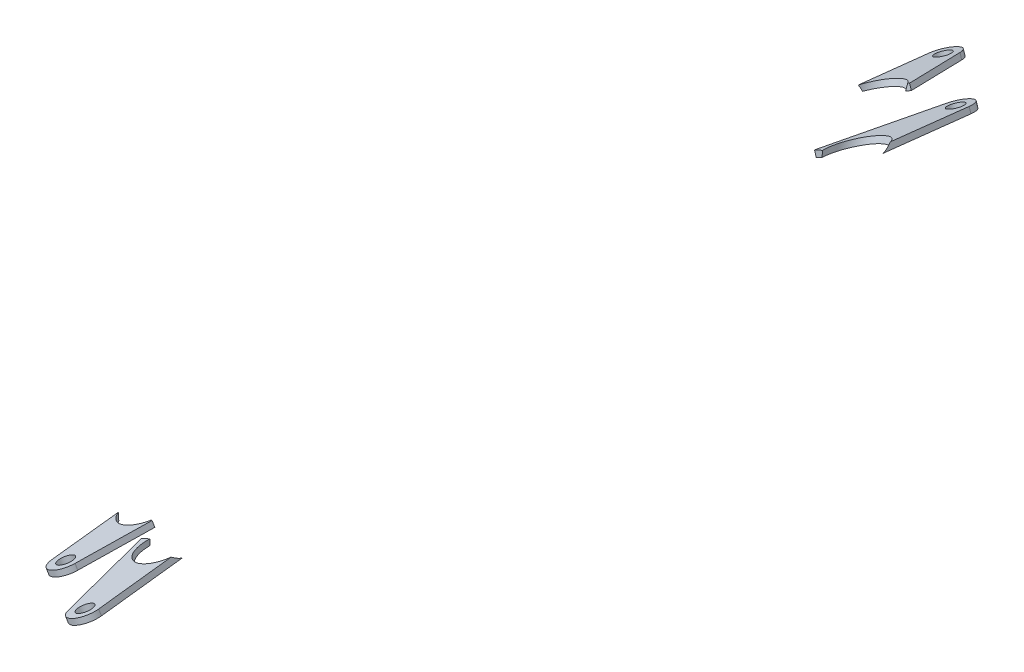
ISO-10303-21;
HEADER;
FILE_DESCRIPTION(('STEP AP214'),'2;1');
FILE_NAME('part.step','',(''),(''),'','','');
FILE_SCHEMA(('AUTOMOTIVE_DESIGN { 1 0 10303 214 1 1 1 1 }'));
ENDSEC;
DATA;
#1=APPLICATION_CONTEXT('core data for automotive mechanical design processes');
#2=APPLICATION_PROTOCOL_DEFINITION('international standard','automotive_design',2000,#1);
#3=PRODUCT_CONTEXT('',#1,'mechanical');
#4=PRODUCT('Part','Part','',(#3));
#5=PRODUCT_RELATED_PRODUCT_CATEGORY('part','',(#4));
#6=PRODUCT_DEFINITION_FORMATION('','',#4);
#7=PRODUCT_DEFINITION_CONTEXT('part definition',#1,'design');
#8=PRODUCT_DEFINITION('design','',#6,#7);
#9=PRODUCT_DEFINITION_SHAPE('','',#8);
#10=(LENGTH_UNIT() NAMED_UNIT(*) SI_UNIT(.MILLI.,.METRE.));
#11=(NAMED_UNIT(*) PLANE_ANGLE_UNIT() SI_UNIT($,.RADIAN.));
#12=(NAMED_UNIT(*) SI_UNIT($,.STERADIAN.) SOLID_ANGLE_UNIT());
#13=UNCERTAINTY_MEASURE_WITH_UNIT(LENGTH_MEASURE(1.E-05),#10,'distance_accuracy_value','');
#14=(GEOMETRIC_REPRESENTATION_CONTEXT(3) GLOBAL_UNCERTAINTY_ASSIGNED_CONTEXT((#13)) GLOBAL_UNIT_ASSIGNED_CONTEXT((#10,
#11,#12)) REPRESENTATION_CONTEXT('',''));
#15=CARTESIAN_POINT('',(0.,0.,0.));
#16=DIRECTION('',(0.,0.,1.));
#17=DIRECTION('',(1.,0.,0.));
#18=AXIS2_PLACEMENT_3D('',#15,#16,#17);
#19=CARTESIAN_POINT('',(755.220495648273,305.928959349761,-3.51439635358468));
#20=DIRECTION('',(0.91036858367164,0.413797562557873,-0.000786819455581464));
#21=DIRECTION('',(-0.413797690645835,0.910368865469472,0.));
#22=AXIS2_PLACEMENT_3D('',#19,#20,#21);
#23=PLANE('',#22);
#24=CARTESIAN_POINT('',(773.70714337,265.612627864231,183.140372076477));
#25=DIRECTION('',(-0.91036858367164,-0.413797562557873,0.000786819455581464));
#26=DIRECTION('',(-0.38047266830248,0.837797270193045,0.391581770173067));
#27=AXIS2_PLACEMENT_3D('',#24,#25,#26);
#28=ELLIPSE('',#27,32.934799029036,12.7);
#29=CARTESIAN_POINT('',(762.450194997699,290.408533129208,199.043656899789));
#30=VERTEX_POINT('',#29);
#31=CARTESIAN_POINT('',(763.732903790025,287.588495796164,200.077199971962));
#32=VERTEX_POINT('',#31);
#33=EDGE_CURVE('E60',#30,#32,#28,.F.);
#34=ORIENTED_EDGE('',*,*,#33,.T.);
#35=DIRECTION('',(-0.0355651587211868,0.0763498446167436,-0.996446597019698));
#36=VECTOR('',#35,1.);
#37=CARTESIAN_POINT('',(756.457296946841,303.207474367985,-3.767066181279));
#38=LINE('',#37,#36);
#39=CARTESIAN_POINT('',(765.006647434923,284.854074444866,235.764304038728));
#40=VERTEX_POINT('',#39);
#41=EDGE_CURVE('E104',#40,#32,#38,.T.);
#42=ORIENTED_EDGE('',*,*,#41,.F.);
#43=DIRECTION('',(0.412267099522663,-0.90716166059207,-0.0842232758981053));
#44=VECTOR('',#43,1.);
#45=CARTESIAN_POINT('',(763.769846136355,287.575559426642,236.016973866422));
#46=LINE('',#45,#44);
#47=CARTESIAN_POINT('',(763.769846136355,287.575559426642,236.016973866422));
#48=VERTEX_POINT('',#47);
#49=EDGE_CURVE('E111',#48,#40,#46,.T.);
#50=ORIENTED_EDGE('',*,*,#49,.F.);
#51=DIRECTION('',(-0.0355651587211868,0.0763498446167436,-0.996446597019698));
#52=VECTOR('',#51,1.);
#53=CARTESIAN_POINT('',(755.220495648273,305.928959349761,-3.51439635358468));
#54=LINE('',#53,#52);
#55=EDGE_CURVE('E115',#48,#30,#54,.T.);
#56=ORIENTED_EDGE('',*,*,#55,.T.);
#57=EDGE_LOOP('',(#34,#42,#50,#56));
#58=FACE_BOUND('',#57,.T.);
#59=ADVANCED_FACE('F50',(#58),#23,.F.);
#60=CARTESIAN_POINT('',(38.2705979143784,-12.2788952686938,-85.5450340725861));
#61=DIRECTION('',(-0.274594410055143,-0.211871373644877,0.937927732288741));
#62=DIRECTION('',(-0.959715618411072,0.,-0.280973186937569));
#63=AXIS2_PLACEMENT_3D('',#60,#61,#62);
#64=PLANE('',#63);
#65=CARTESIAN_POINT('',(773.70714337,323.924000024888,205.712516138667));
#66=DIRECTION('',(0.274594410055143,0.211871373644877,-0.937927732288741));
#67=DIRECTION('',(0.0391090583006917,0.972154845922359,0.231052888119817));
#68=AXIS2_PLACEMENT_3D('',#65,#66,#67);
#69=ELLIPSE('',#68,90.0697108466193,12.7);
#70=CARTESIAN_POINT('',(784.311775297273,296.700239258026,202.667544929037));
#71=VERTEX_POINT('',#70);
#72=CARTESIAN_POINT('',(784.582924025757,300.052801302066,203.50424889206));
#73=VERTEX_POINT('',#72);
#74=EDGE_CURVE('E12',#71,#73,#69,.F.);
#75=ORIENTED_EDGE('',*,*,#74,.T.);
#76=DIRECTION('',(0.868696580295812,0.363549504994396,0.336449117699379));
#77=VECTOR('',#76,1.);
#78=CARTESIAN_POINT('',(38.2705979143784,-12.2788952686938,-85.5450340725861));
#79=LINE('',#78,#77);
#80=CARTESIAN_POINT('',(785.32703868222,300.364213273923,203.792447010152));
#81=VERTEX_POINT('',#80);
#82=EDGE_CURVE('E119',#73,#81,#79,.T.);
#83=ORIENTED_EDGE('',*,*,#82,.T.);
#84=DIRECTION('',(0.412267099522663,-0.90716166059207,-0.0842232758981053));
#85=VECTOR('',#84,1.);
#86=CARTESIAN_POINT('',(785.32703868222,300.364213273923,203.792447010152));
#87=LINE('',#86,#85);
#88=CARTESIAN_POINT('',(786.563839980788,297.642728292147,203.539777182457));
#89=VERTEX_POINT('',#88);
#90=EDGE_CURVE('E136',#81,#89,#87,.T.);
#91=ORIENTED_EDGE('',*,*,#90,.T.);
#92=DIRECTION('',(0.868696580295812,0.363549504994396,0.336449117699379));
#93=VECTOR('',#92,1.);
#94=CARTESIAN_POINT('',(39.5073992129464,-15.0003802504701,-85.7977039002804));
#95=LINE('',#94,#93);
#96=EDGE_CURVE('E54',#71,#89,#95,.T.);
#97=ORIENTED_EDGE('',*,*,#96,.F.);
#98=EDGE_LOOP('',(#75,#83,#91,#97));
#99=FACE_BOUND('',#98,.T.);
#100=ADVANCED_FACE('F52',(#99),#64,.F.);
#101=CARTESIAN_POINT('',(782.068458465576,297.436246222544,219.378803916979));
#102=DIRECTION('',(-0.888553466829776,-0.379936958652686,-0.257139347503514));
#103=DIRECTION('',(0.393157128419409,-0.919471300461849,0.));
#104=AXIS2_PLACEMENT_3D('',#101,#102,#103);
#105=PLANE('',#104);
#106=DIRECTION('',(-0.201267422192357,-0.180846976755446,0.962697146439346));
#107=VECTOR('',#106,1.);
#108=CARTESIAN_POINT('',(783.305259764144,294.714761240768,219.126134089285));
#109=LINE('',#108,#107);
#110=CARTESIAN_POINT('',(779.398023838934,291.20395061455,237.815124263111));
#111=VERTEX_POINT('',#110);
#112=EDGE_CURVE('E137',#89,#111,#109,.T.);
#113=ORIENTED_EDGE('',*,*,#112,.F.);
#114=ORIENTED_EDGE('',*,*,#90,.F.);
#115=DIRECTION('',(-0.201267422192357,-0.180846976755446,0.962697146439346));
#116=VECTOR('',#115,1.);
#117=CARTESIAN_POINT('',(782.068458465576,297.436246222544,219.378803916979));
#118=LINE('',#117,#116);
#119=CARTESIAN_POINT('',(778.161222540366,293.925435596327,238.067794090805));
#120=VERTEX_POINT('',#119);
#121=EDGE_CURVE('E121',#81,#120,#118,.T.);
#122=ORIENTED_EDGE('',*,*,#121,.T.);
#123=DIRECTION('',(0.412267099522663,-0.90716166059207,-0.0842232758981053));
#124=VECTOR('',#123,1.);
#125=CARTESIAN_POINT('',(778.161222540366,293.925435596327,238.067794090805));
#126=LINE('',#125,#124);
#127=EDGE_CURVE('E128',#120,#111,#126,.T.);
#128=ORIENTED_EDGE('',*,*,#127,.T.);
#129=EDGE_LOOP('',(#113,#114,#122,#128));
#130=FACE_BOUND('',#129,.T.);
#131=ADVANCED_FACE('F146',(#130),#105,.F.);
#132=CARTESIAN_POINT('',(771.052794805728,290.885939927105,236.010679310777));
#133=DIRECTION('',(0.412267099522663,-0.90716166059207,-0.0842232758981053));
#134=DIRECTION('',(0.910396383001479,0.413737145803739,0.));
#135=AXIS2_PLACEMENT_3D('',#132,#133,#134);
#136=CYLINDRICAL_SURFACE('',#135,7.99999999999997);
#137=CARTESIAN_POINT('',(772.289596104296,288.164454945329,235.758009483083));
#138=DIRECTION('',(-0.412267099522663,0.90716166059207,0.0842232758981056));
#139=DIRECTION('',(0.910396383001479,0.413737145803739,0.));
#140=AXIS2_PLACEMENT_3D('',#137,#138,#139);
#141=CIRCLE('',#140,7.99999999999997);
#142=EDGE_CURVE('E100',#40,#111,#141,.T.);
#143=ORIENTED_EDGE('',*,*,#142,.T.);
#144=ORIENTED_EDGE('',*,*,#127,.F.);
#145=CARTESIAN_POINT('',(771.052794805728,290.885939927105,236.010679310777));
#146=DIRECTION('',(-0.412267099522663,0.90716166059207,0.0842232758981056));
#147=DIRECTION('',(0.910396383001479,0.413737145803739,0.));
#148=AXIS2_PLACEMENT_3D('',#145,#146,#147);
#149=CIRCLE('',#148,7.99999999999997);
#150=EDGE_CURVE('E132',#48,#120,#149,.T.);
#151=ORIENTED_EDGE('',*,*,#150,.F.);
#152=ORIENTED_EDGE('',*,*,#49,.T.);
#153=EDGE_LOOP('',(#143,#144,#151,#152));
#154=FACE_BOUND('',#153,.T.);
#155=ADVANCED_FACE('F148',(#154),#136,.T.);
#156=CARTESIAN_POINT('',(771.052794805728,290.885939927105,236.010679310777));
#157=DIRECTION('',(0.412267099522663,-0.90716166059207,-0.0842232758981053));
#158=DIRECTION('',(0.910396383001479,0.413737145803739,0.));
#159=AXIS2_PLACEMENT_3D('',#156,#157,#158);
#160=CYLINDRICAL_SURFACE('',#159,4.10000000000003);
#161=CARTESIAN_POINT('',(771.052794805728,290.885939927105,236.010679310777));
#162=DIRECTION('',(-0.412267099522663,0.90716166059207,0.0842232758981056));
#163=DIRECTION('',(0.910396383001479,0.413737145803739,0.));
#164=AXIS2_PLACEMENT_3D('',#161,#162,#163);
#165=CIRCLE('',#164,4.10000000000003);
#166=CARTESIAN_POINT('',(774.785419976034,292.5822622249,236.010679310777));
#167=VERTEX_POINT('',#166);
#168=EDGE_CURVE('E101',#167,#167,#165,.T.);
#169=ORIENTED_EDGE('',*,*,#168,.T.);
#170=EDGE_LOOP('',(#169));
#171=FACE_BOUND('',#170,.T.);
#172=CARTESIAN_POINT('',(772.289596104296,288.164454945329,235.758009483083));
#173=DIRECTION('',(-0.412267099522663,0.90716166059207,0.0842232758981056));
#174=DIRECTION('',(0.910396383001479,0.413737145803739,0.));
#175=AXIS2_PLACEMENT_3D('',#172,#173,#174);
#176=CIRCLE('',#175,4.10000000000003);
#177=CARTESIAN_POINT('',(776.022221274602,289.860777243124,235.758009483083));
#178=VERTEX_POINT('',#177);
#179=EDGE_CURVE('E122',#178,#178,#176,.T.);
#180=ORIENTED_EDGE('',*,*,#179,.F.);
#181=EDGE_LOOP('',(#180));
#182=FACE_BOUND('',#181,.T.);
#183=ADVANCED_FACE('F153',(#171,#182),#160,.F.);
#184=CARTESIAN_POINT('',(14.0671860297918,-30.9537478334286,-2.87382740817523));
#185=DIRECTION('',(0.412267099522663,-0.90716166059207,-0.0842232758981056));
#186=DIRECTION('',(0.910396383001479,0.413737145803739,0.));
#187=AXIS2_PLACEMENT_3D('',#184,#185,#186);
#188=PLANE('',#187);
#189=CARTESIAN_POINT('',(773.70714337,295.911920197914,194.869130399193));
#190=DIRECTION('',(-0.412267099522663,0.90716166059207,0.0842232758981056));
#191=DIRECTION('',(0.750233682493832,0.285586575534018,0.596313449057202));
#192=AXIS2_PLACEMENT_3D('',#189,#190,#191);
#193=ELLIPSE('',#192,14.4911970053176,12.7);
#194=EDGE_CURVE('E67',#73,#30,#193,.F.);
#195=ORIENTED_EDGE('',*,*,#194,.T.);
#196=ORIENTED_EDGE('',*,*,#55,.F.);
#197=ORIENTED_EDGE('',*,*,#150,.T.);
#198=ORIENTED_EDGE('',*,*,#121,.F.);
#199=ORIENTED_EDGE('',*,*,#82,.F.);
#200=EDGE_LOOP('',(#195,#196,#197,#198,#199));
#201=FACE_BOUND('',#200,.T.);
#202=ORIENTED_EDGE('',*,*,#168,.F.);
#203=EDGE_LOOP('',(#202));
#204=FACE_BOUND('',#203,.T.);
#205=ADVANCED_FACE('F150',(#201,#204),#188,.F.);
#206=CARTESIAN_POINT('',(15.3039873283598,-33.6752328152048,-3.12649723586955));
#207=DIRECTION('',(0.412267099522663,-0.90716166059207,-0.0842232758981056));
#208=DIRECTION('',(0.910396383001479,0.413737145803739,0.));
#209=AXIS2_PLACEMENT_3D('',#206,#207,#208);
#210=PLANE('',#209);
#211=ORIENTED_EDGE('',*,*,#96,.T.);
#212=ORIENTED_EDGE('',*,*,#112,.T.);
#213=ORIENTED_EDGE('',*,*,#142,.F.);
#214=ORIENTED_EDGE('',*,*,#41,.T.);
#215=CARTESIAN_POINT('',(773.70714337,292.719630111387,193.633405204408));
#216=DIRECTION('',(-0.412267099522663,0.90716166059207,0.0842232758981056));
#217=DIRECTION('',(0.750233682493832,0.285586575534018,0.596313449057202));
#218=AXIS2_PLACEMENT_3D('',#215,#216,#217);
#219=ELLIPSE('',#218,14.4911970053176,12.7);
#220=EDGE_CURVE('E93',#71,#32,#219,.F.);
#221=ORIENTED_EDGE('',*,*,#220,.F.);
#222=EDGE_LOOP('',(#211,#212,#213,#214,#221));
#223=FACE_BOUND('',#222,.T.);
#224=ORIENTED_EDGE('',*,*,#179,.T.);
#225=EDGE_LOOP('',(#224));
#226=FACE_BOUND('',#225,.T.);
#227=ADVANCED_FACE('F105',(#223,#226),#210,.T.);
#228=CARTESIAN_POINT('',(773.70714337,180.,150.));
#229=DIRECTION('',(0.,0.932568098274089,0.360994102557716));
#230=DIRECTION('',(0.,0.360994102557716,-0.932568098274089));
#231=AXIS2_PLACEMENT_3D('',#228,#229,#230);
#232=CYLINDRICAL_SURFACE('',#231,12.7);
#233=ORIENTED_EDGE('',*,*,#194,.F.);
#234=ORIENTED_EDGE('',*,*,#74,.F.);
#235=ORIENTED_EDGE('',*,*,#220,.T.);
#236=ORIENTED_EDGE('',*,*,#33,.F.);
#237=EDGE_LOOP('',(#233,#234,#235,#236));
#238=FACE_BOUND('',#237,.T.);
#239=ADVANCED_FACE('F95',(#238),#232,.F.);
#240=CLOSED_SHELL('',(#59,#100,#131,#155,#183,#205,#227,#239));
#241=MANIFOLD_SOLID_BREP('B2',#240);
#242=CARTESIAN_POINT('',(30.2213269685522,-67.0319342963956,179.837759251258));
#243=DIRECTION('',(0.0337648746936545,-0.0771679621189108,0.996446204699148));
#244=DIRECTION('',(0.,0.997014698435552,0.0772119880812847));
#245=AXIS2_PLACEMENT_3D('',#242,#243,#244);
#246=PLANE('',#245);
#247=CARTESIAN_POINT('',(773.70714337,256.780831863416,179.721612334226));
#248=DIRECTION('',(-0.0337648746936545,0.0771679621189108,-0.996446204699148));
#249=DIRECTION('',(-0.0101447941648544,0.996936870643108,0.0775497202037446));
#250=AXIS2_PLACEMENT_3D('',#247,#248,#249);
#251=ELLIPSE('',#250,44.1360215042752,12.7);
#252=CARTESIAN_POINT('',(761.360605704508,268.435503662789,181.042553256968));
#253=VERTEX_POINT('',#252);
#254=CARTESIAN_POINT('',(761.164875684905,265.063165913385,180.788021069564));
#255=VERTEX_POINT('',#254);
#256=EDGE_CURVE('E48',#253,#255,#251,.F.);
#257=ORIENTED_EDGE('',*,*,#256,.T.);
#258=DIRECTION('',(-0.91043713230958,-0.413645774998672,-0.0011836121220593));
#259=VECTOR('',#258,1.);
#260=CARTESIAN_POINT('',(30.2213269685522,-67.0319342963956,179.837759251258));
#261=LINE('',#260,#259);
#262=CARTESIAN_POINT('',(758.127343400671,263.68310094107,180.784072131295));
#263=VERTEX_POINT('',#262);
#264=EDGE_CURVE('E243',#255,#263,#261,.T.);
#265=ORIENTED_EDGE('',*,*,#264,.T.);
#266=DIRECTION('',(-0.412267099522663,0.90716166059207,0.0842232758981053));
#267=VECTOR('',#266,1.);
#268=CARTESIAN_POINT('',(758.127343400671,263.68310094107,180.784072131295));
#269=LINE('',#268,#267);
#270=CARTESIAN_POINT('',(756.890542102103,266.404585922846,181.03674195899));
#271=VERTEX_POINT('',#270);
#272=EDGE_CURVE('E300',#263,#271,#269,.T.);
#273=ORIENTED_EDGE('',*,*,#272,.T.);
#274=DIRECTION('',(-0.91043713230958,-0.413645774998672,-0.0011836121220593));
#275=VECTOR('',#274,1.);
#276=CARTESIAN_POINT('',(28.9845256699842,-64.3104493146194,180.090429078952));
#277=LINE('',#276,#275);
#278=EDGE_CURVE('E290',#253,#271,#277,.T.);
#279=ORIENTED_EDGE('',*,*,#278,.F.);
#280=EDGE_LOOP('',(#257,#265,#273,#279));
#281=FACE_BOUND('',#280,.T.);
#282=ADVANCED_FACE('F239',(#281),#246,.F.);
#283=CARTESIAN_POINT('',(780.947205194272,269.114060072895,233.989320689223));
#284=DIRECTION('',(-0.412267099522663,0.90716166059207,0.0842232758981053));
#285=DIRECTION('',(-0.910396383001479,-0.413737145803739,0.));
#286=AXIS2_PLACEMENT_3D('',#283,#284,#285);
#287=CYLINDRICAL_SURFACE('',#286,7.99999999999997);
#288=CARTESIAN_POINT('',(779.710403895704,271.835545054672,234.241990516917));
#289=DIRECTION('',(-0.412267099522663,0.90716166059207,0.0842232758981055));
#290=DIRECTION('',(0.910396383001479,0.413737145803739,0.));
#291=AXIS2_PLACEMENT_3D('',#288,#289,#290);
#292=CIRCLE('',#291,7.99999999999997);
#293=CARTESIAN_POINT('',(772.763379310737,268.481673731481,236.3610460998));
#294=VERTEX_POINT('',#293);
#295=CARTESIAN_POINT('',(786.991358591738,275.14980934968,234.184103582942));
#296=VERTEX_POINT('',#295);
#297=EDGE_CURVE('E301',#294,#296,#292,.T.);
#298=ORIENTED_EDGE('',*,*,#297,.F.);
#299=DIRECTION('',(-0.412267099522663,0.90716166059207,0.0842232758981053));
#300=VECTOR('',#299,1.);
#301=CARTESIAN_POINT('',(774.000180609305,265.760188749705,236.108376272105));
#302=LINE('',#301,#300);
#303=CARTESIAN_POINT('',(774.000180609305,265.760188749705,236.108376272105));
#304=VERTEX_POINT('',#303);
#305=EDGE_CURVE('E330',#304,#294,#302,.T.);
#306=ORIENTED_EDGE('',*,*,#305,.F.);
#307=CARTESIAN_POINT('',(780.947205194272,269.114060072895,233.989320689223));
#308=DIRECTION('',(-0.412267099522663,0.90716166059207,0.0842232758981055));
#309=DIRECTION('',(0.910396383001479,0.413737145803739,0.));
#310=AXIS2_PLACEMENT_3D('',#307,#308,#309);
#311=CIRCLE('',#310,7.99999999999997);
#312=CARTESIAN_POINT('',(788.228159890306,272.428324367904,233.931433755248));
#313=VERTEX_POINT('',#312);
#314=EDGE_CURVE('E307',#304,#313,#311,.T.);
#315=ORIENTED_EDGE('',*,*,#314,.T.);
#316=DIRECTION('',(-0.412267099522663,0.90716166059207,0.0842232758981053));
#317=VECTOR('',#316,1.);
#318=CARTESIAN_POINT('',(788.228159890306,272.428324367904,233.931433755248));
#319=LINE('',#318,#317);
#320=EDGE_CURVE('E322',#313,#296,#319,.T.);
#321=ORIENTED_EDGE('',*,*,#320,.T.);
#322=EDGE_LOOP('',(#298,#306,#315,#321));
#323=FACE_BOUND('',#322,.T.);
#324=ADVANCED_FACE('F335',(#323),#287,.T.);
#325=CARTESIAN_POINT('',(778.042271974727,290.529173762203,-10.8904737495589));
#326=DIRECTION('',(-0.910119337004301,-0.414283036876087,0.00723586674687682));
#327=DIRECTION('',(0.414293882769467,-0.910143163848303,0.));
#328=AXIS2_PLACEMENT_3D('',#325,#326,#327);
#329=PLANE('',#328);
#330=CARTESIAN_POINT('',(773.70714337,303.699265625671,197.883586693808));
#331=DIRECTION('',(0.910119337004301,0.414283036876087,-0.00723586674687682));
#332=DIRECTION('',(-0.378198316118886,0.837726831942564,0.39392865944015));
#333=AXIS2_PLACEMENT_3D('',#330,#331,#332);
#334=ELLIPSE('',#333,33.0957528547096,12.7);
#335=CARTESIAN_POINT('',(786.337924769243,275.787369895378,188.498873353375));
#336=VERTEX_POINT('',#335);
#337=CARTESIAN_POINT('',(785.300926728992,278.153794158122,193.553894751429));
#338=VERTEX_POINT('',#337);
#339=EDGE_CURVE('E295',#336,#338,#334,.F.);
#340=ORIENTED_EDGE('',*,*,#339,.T.);
#341=DIRECTION('',(-0.0414563754086394,0.0736701222244467,-0.99642063508812));
#342=VECTOR('',#341,1.);
#343=CARTESIAN_POINT('',(776.805470676159,293.250658743979,-10.6378039218646));
#344=LINE('',#343,#342);
#345=EDGE_CURVE('E293',#296,#338,#344,.T.);
#346=ORIENTED_EDGE('',*,*,#345,.F.);
#347=ORIENTED_EDGE('',*,*,#320,.F.);
#348=DIRECTION('',(-0.0414563754086394,0.0736701222244467,-0.99642063508812));
#349=VECTOR('',#348,1.);
#350=CARTESIAN_POINT('',(778.042271974727,290.529173762203,-10.8904737495589));
#351=LINE('',#350,#349);
#352=EDGE_CURVE('E303',#313,#336,#351,.T.);
#353=ORIENTED_EDGE('',*,*,#352,.T.);
#354=EDGE_LOOP('',(#340,#346,#347,#353));
#355=FACE_BOUND('',#354,.T.);
#356=ADVANCED_FACE('F336',(#355),#329,.F.);
#357=CARTESIAN_POINT('',(780.947205194272,269.114060072895,233.989320689223));
#358=DIRECTION('',(-0.412267099522663,0.90716166059207,0.0842232758981053));
#359=DIRECTION('',(-0.910396383001479,-0.413737145803739,0.));
#360=AXIS2_PLACEMENT_3D('',#357,#358,#359);
#361=CYLINDRICAL_SURFACE('',#360,4.10000000000003);
#362=CARTESIAN_POINT('',(780.947205194272,269.114060072895,233.989320689223));
#363=DIRECTION('',(-0.412267099522663,0.90716166059207,0.0842232758981055));
#364=DIRECTION('',(0.910396383001479,0.413737145803739,0.));
#365=AXIS2_PLACEMENT_3D('',#362,#363,#364);
#366=CIRCLE('',#365,4.10000000000003);
#367=CARTESIAN_POINT('',(784.679830364578,270.810382370691,233.989320689223));
#368=VERTEX_POINT('',#367);
#369=EDGE_CURVE('E317',#368,#368,#366,.T.);
#370=ORIENTED_EDGE('',*,*,#369,.F.);
#371=EDGE_LOOP('',(#370));
#372=FACE_BOUND('',#371,.T.);
#373=CARTESIAN_POINT('',(779.710403895704,271.835545054672,234.241990516917));
#374=DIRECTION('',(-0.412267099522663,0.90716166059207,0.0842232758981055));
#375=DIRECTION('',(0.910396383001479,0.413737145803739,0.));
#376=AXIS2_PLACEMENT_3D('',#373,#374,#375);
#377=CIRCLE('',#376,4.10000000000003);
#378=CARTESIAN_POINT('',(783.44302906601,273.531867352467,234.241990516917));
#379=VERTEX_POINT('',#378);
#380=EDGE_CURVE('E312',#379,#379,#377,.T.);
#381=ORIENTED_EDGE('',*,*,#380,.T.);
#382=EDGE_LOOP('',(#381));
#383=FACE_BOUND('',#382,.T.);
#384=ADVANCED_FACE('F338',(#372,#383),#361,.F.);
#385=CARTESIAN_POINT('',(650.061860025907,249.541867392107,-195.874970657669));
#386=DIRECTION('',(0.868378073120865,0.419233915398796,-0.264881947860342));
#387=DIRECTION('',(-0.4347632915201,0.900544768652069,0.));
#388=AXIS2_PLACEMENT_3D('',#385,#386,#387);
#389=PLANE('',#388);
#390=DIRECTION('',(0.275600001404326,0.0360644663239728,0.960595645157057));
#391=VECTOR('',#390,1.);
#392=CARTESIAN_POINT('',(648.825058727339,252.263352373884,-195.622300829974));
#393=LINE('',#392,#391);
#394=EDGE_CURVE('E320',#271,#294,#393,.T.);
#395=ORIENTED_EDGE('',*,*,#394,.F.);
#396=ORIENTED_EDGE('',*,*,#272,.F.);
#397=DIRECTION('',(0.275600001404326,0.0360644663239728,0.960595645157057));
#398=VECTOR('',#397,1.);
#399=CARTESIAN_POINT('',(650.061860025907,249.541867392107,-195.874970657669));
#400=LINE('',#399,#398);
#401=EDGE_CURVE('E306',#263,#304,#400,.T.);
#402=ORIENTED_EDGE('',*,*,#401,.T.);
#403=ORIENTED_EDGE('',*,*,#305,.T.);
#404=EDGE_LOOP('',(#395,#396,#402,#403));
#405=FACE_BOUND('',#404,.T.);
#406=ADVANCED_FACE('F343',(#405),#389,.F.);
#407=CARTESIAN_POINT('',(23.961596418336,-52.7256276876387,-4.8951860297298));
#408=DIRECTION('',(0.412267099522663,-0.90716166059207,-0.0842232758981055));
#409=DIRECTION('',(0.910396383001479,0.413737145803739,0.));
#410=AXIS2_PLACEMENT_3D('',#407,#408,#409);
#411=PLANE('',#410);
#412=ORIENTED_EDGE('',*,*,#369,.T.);
#413=EDGE_LOOP('',(#412));
#414=FACE_BOUND('',#413,.T.);
#415=ORIENTED_EDGE('',*,*,#352,.F.);
#416=ORIENTED_EDGE('',*,*,#314,.F.);
#417=ORIENTED_EDGE('',*,*,#401,.F.);
#418=ORIENTED_EDGE('',*,*,#264,.F.);
#419=CARTESIAN_POINT('',(773.70714337,270.373599505699,184.983328840916));
#420=DIRECTION('',(-0.412267099522663,0.90716166059207,0.0842232758981055));
#421=DIRECTION('',(0.750233682493832,0.285586575534019,0.596313449057202));
#422=AXIS2_PLACEMENT_3D('',#419,#420,#421);
#423=ELLIPSE('',#422,14.4911970053176,12.7);
#424=EDGE_CURVE('E258',#336,#255,#423,.F.);
#425=ORIENTED_EDGE('',*,*,#424,.F.);
#426=EDGE_LOOP('',(#415,#416,#417,#418,#425));
#427=FACE_BOUND('',#426,.T.);
#428=ADVANCED_FACE('F304',(#414,#427),#411,.T.);
#429=CARTESIAN_POINT('',(22.724795119768,-50.0041427058625,-4.64251620203548));
#430=DIRECTION('',(0.412267099522663,-0.90716166059207,-0.0842232758981055));
#431=DIRECTION('',(0.910396383001479,0.413737145803739,0.));
#432=AXIS2_PLACEMENT_3D('',#429,#430,#431);
#433=PLANE('',#432);
#434=CARTESIAN_POINT('',(773.70714337,273.565889592226,186.219054035701));
#435=DIRECTION('',(-0.412267099522663,0.90716166059207,0.0842232758981055));
#436=DIRECTION('',(0.750233682493832,0.285586575534019,0.596313449057202));
#437=AXIS2_PLACEMENT_3D('',#434,#435,#436);
#438=ELLIPSE('',#437,14.4911970053176,12.7);
#439=EDGE_CURVE('E249',#338,#253,#438,.F.);
#440=ORIENTED_EDGE('',*,*,#439,.T.);
#441=ORIENTED_EDGE('',*,*,#278,.T.);
#442=ORIENTED_EDGE('',*,*,#394,.T.);
#443=ORIENTED_EDGE('',*,*,#297,.T.);
#444=ORIENTED_EDGE('',*,*,#345,.T.);
#445=EDGE_LOOP('',(#440,#441,#442,#443,#444));
#446=FACE_BOUND('',#445,.T.);
#447=ORIENTED_EDGE('',*,*,#380,.F.);
#448=EDGE_LOOP('',(#447));
#449=FACE_BOUND('',#448,.T.);
#450=ADVANCED_FACE('F288',(#446,#449),#433,.F.);
#451=CARTESIAN_POINT('',(773.70714337,180.,150.));
#452=DIRECTION('',(0.,0.932568098274089,0.360994102557716));
#453=DIRECTION('',(0.,0.360994102557716,-0.932568098274089));
#454=AXIS2_PLACEMENT_3D('',#451,#452,#453);
#455=CYLINDRICAL_SURFACE('',#454,12.7);
#456=ORIENTED_EDGE('',*,*,#339,.F.);
#457=ORIENTED_EDGE('',*,*,#424,.T.);
#458=ORIENTED_EDGE('',*,*,#256,.F.);
#459=ORIENTED_EDGE('',*,*,#439,.F.);
#460=EDGE_LOOP('',(#456,#457,#458,#459));
#461=FACE_BOUND('',#460,.T.);
#462=ADVANCED_FACE('F241',(#461),#455,.F.);
#463=CLOSED_SHELL('',(#282,#324,#356,#384,#406,#428,#450,#462));
#464=MANIFOLD_SOLID_BREP('B6',#463);
#465=CARTESIAN_POINT('',(755.220495648273,305.928959349761,3.51439635358468));
#466=DIRECTION('',(0.91036858367164,0.413797562557873,0.000786819455581464));
#467=DIRECTION('',(-0.413797690645835,0.910368865469472,0.));
#468=AXIS2_PLACEMENT_3D('',#465,#466,#467);
#469=PLANE('',#468);
#470=CARTESIAN_POINT('',(773.70714337,265.612627864231,-183.140372076477));
#471=DIRECTION('',(0.91036858367164,0.413797562557873,0.000786819455581464));
#472=DIRECTION('',(-0.38047266830248,0.837797270193045,-0.391581770173067));
#473=AXIS2_PLACEMENT_3D('',#470,#471,#472);
#474=ELLIPSE('',#473,32.934799029036,12.7);
#475=CARTESIAN_POINT('',(762.450194997699,290.408533129208,-199.043656899789));
#476=VERTEX_POINT('',#475);
#477=CARTESIAN_POINT('',(763.732903790025,287.588495796164,-200.077199971962));
#478=VERTEX_POINT('',#477);
#479=EDGE_CURVE('E437',#476,#478,#474,.F.);
#480=ORIENTED_EDGE('',*,*,#479,.F.);
#481=DIRECTION('',(-0.0355651587211868,0.0763498446167436,0.996446597019698));
#482=VECTOR('',#481,1.);
#483=CARTESIAN_POINT('',(755.220495648273,305.928959349761,3.51439635358468));
#484=LINE('',#483,#482);
#485=CARTESIAN_POINT('',(763.769846136355,287.575559426642,-236.016973866422));
#486=VERTEX_POINT('',#485);
#487=EDGE_CURVE('E498',#486,#476,#484,.T.);
#488=ORIENTED_EDGE('',*,*,#487,.F.);
#489=DIRECTION('',(0.412267099522663,-0.90716166059207,0.0842232758981053));
#490=VECTOR('',#489,1.);
#491=CARTESIAN_POINT('',(763.769846136355,287.575559426642,-236.016973866422));
#492=LINE('',#491,#490);
#493=CARTESIAN_POINT('',(765.006647434923,284.854074444866,-235.764304038728));
#494=VERTEX_POINT('',#493);
#495=EDGE_CURVE('E489',#486,#494,#492,.T.);
#496=ORIENTED_EDGE('',*,*,#495,.T.);
#497=DIRECTION('',(-0.0355651587211868,0.0763498446167436,0.996446597019698));
#498=VECTOR('',#497,1.);
#499=CARTESIAN_POINT('',(756.457296946841,303.207474367985,3.767066181279));
#500=LINE('',#499,#498);
#501=EDGE_CURVE('E483',#494,#478,#500,.T.);
#502=ORIENTED_EDGE('',*,*,#501,.T.);
#503=EDGE_LOOP('',(#480,#488,#496,#502));
#504=FACE_BOUND('',#503,.T.);
#505=ADVANCED_FACE('F427',(#504),#469,.F.);
#506=CARTESIAN_POINT('',(38.2705979143784,-12.2788952686938,85.5450340725861));
#507=DIRECTION('',(-0.274594410055143,-0.211871373644877,-0.937927732288741));
#508=DIRECTION('',(-0.959715618411072,0.,0.280973186937569));
#509=AXIS2_PLACEMENT_3D('',#506,#507,#508);
#510=PLANE('',#509);
#511=CARTESIAN_POINT('',(773.70714337,323.924000024888,-205.712516138667));
#512=DIRECTION('',(-0.274594410055143,-0.211871373644877,-0.937927732288741));
#513=DIRECTION('',(0.0391090583006917,0.972154845922359,-0.231052888119817));
#514=AXIS2_PLACEMENT_3D('',#511,#512,#513);
#515=ELLIPSE('',#514,90.0697108466193,12.7);
#516=CARTESIAN_POINT('',(784.311775297273,296.700239258026,-202.667544929037));
#517=VERTEX_POINT('',#516);
#518=CARTESIAN_POINT('',(784.582924025757,300.052801302066,-203.50424889206));
#519=VERTEX_POINT('',#518);
#520=EDGE_CURVE('E237',#517,#519,#515,.F.);
#521=ORIENTED_EDGE('',*,*,#520,.F.);
#522=DIRECTION('',(0.868696580295812,0.363549504994396,-0.336449117699379));
#523=VECTOR('',#522,1.);
#524=CARTESIAN_POINT('',(39.5073992129464,-15.0003802504701,85.7977039002804));
#525=LINE('',#524,#523);
#526=CARTESIAN_POINT('',(786.563839980788,297.642728292147,-203.539777182457));
#527=VERTEX_POINT('',#526);
#528=EDGE_CURVE('E431',#517,#527,#525,.T.);
#529=ORIENTED_EDGE('',*,*,#528,.T.);
#530=DIRECTION('',(0.412267099522663,-0.90716166059207,0.0842232758981053));
#531=VECTOR('',#530,1.);
#532=CARTESIAN_POINT('',(785.32703868222,300.364213273923,-203.792447010152));
#533=LINE('',#532,#531);
#534=CARTESIAN_POINT('',(785.32703868222,300.364213273923,-203.792447010152));
#535=VERTEX_POINT('',#534);
#536=EDGE_CURVE('E506',#535,#527,#533,.T.);
#537=ORIENTED_EDGE('',*,*,#536,.F.);
#538=DIRECTION('',(0.868696580295812,0.363549504994396,-0.336449117699379));
#539=VECTOR('',#538,1.);
#540=CARTESIAN_POINT('',(38.2705979143784,-12.2788952686938,85.5450340725861));
#541=LINE('',#540,#539);
#542=EDGE_CURVE('E501',#519,#535,#541,.T.);
#543=ORIENTED_EDGE('',*,*,#542,.F.);
#544=EDGE_LOOP('',(#521,#529,#537,#543));
#545=FACE_BOUND('',#544,.T.);
#546=ADVANCED_FACE('F429',(#545),#510,.F.);
#547=CARTESIAN_POINT('',(782.068458465576,297.436246222544,-219.378803916979));
#548=DIRECTION('',(-0.888553466829776,-0.379936958652686,0.257139347503514));
#549=DIRECTION('',(0.393157128419409,-0.919471300461849,0.));
#550=AXIS2_PLACEMENT_3D('',#547,#548,#549);
#551=PLANE('',#550);
#552=DIRECTION('',(-0.201267422192357,-0.180846976755446,-0.962697146439346));
#553=VECTOR('',#552,1.);
#554=CARTESIAN_POINT('',(783.305259764144,294.714761240768,-219.126134089285));
#555=LINE('',#554,#553);
#556=CARTESIAN_POINT('',(779.398023838934,291.20395061455,-237.815124263111));
#557=VERTEX_POINT('',#556);
#558=EDGE_CURVE('E491',#527,#557,#555,.T.);
#559=ORIENTED_EDGE('',*,*,#558,.T.);
#560=DIRECTION('',(0.412267099522663,-0.90716166059207,0.0842232758981053));
#561=VECTOR('',#560,1.);
#562=CARTESIAN_POINT('',(778.161222540366,293.925435596327,-238.067794090805));
#563=LINE('',#562,#561);
#564=CARTESIAN_POINT('',(778.161222540366,293.925435596327,-238.067794090805));
#565=VERTEX_POINT('',#564);
#566=EDGE_CURVE('E505',#565,#557,#563,.T.);
#567=ORIENTED_EDGE('',*,*,#566,.F.);
#568=DIRECTION('',(-0.201267422192357,-0.180846976755446,-0.962697146439346));
#569=VECTOR('',#568,1.);
#570=CARTESIAN_POINT('',(782.068458465576,297.436246222544,-219.378803916979));
#571=LINE('',#570,#569);
#572=EDGE_CURVE('E499',#535,#565,#571,.T.);
#573=ORIENTED_EDGE('',*,*,#572,.F.);
#574=ORIENTED_EDGE('',*,*,#536,.T.);
#575=EDGE_LOOP('',(#559,#567,#573,#574));
#576=FACE_BOUND('',#575,.T.);
#577=ADVANCED_FACE('F523',(#576),#551,.F.);
#578=CARTESIAN_POINT('',(771.052794805728,290.885939927105,-236.010679310777));
#579=DIRECTION('',(0.412267099522663,-0.90716166059207,0.0842232758981053));
#580=DIRECTION('',(0.910396383001479,0.413737145803739,0.));
#581=AXIS2_PLACEMENT_3D('',#578,#579,#580);
#582=CYLINDRICAL_SURFACE('',#581,7.99999999999997);
#583=CARTESIAN_POINT('',(772.289596104296,288.164454945329,-235.758009483083));
#584=DIRECTION('',(0.412267099522663,-0.90716166059207,0.0842232758981056));
#585=DIRECTION('',(0.910396383001479,0.413737145803739,0.));
#586=AXIS2_PLACEMENT_3D('',#583,#584,#585);
#587=CIRCLE('',#586,7.99999999999997);
#588=EDGE_CURVE('E486',#494,#557,#587,.T.);
#589=ORIENTED_EDGE('',*,*,#588,.F.);
#590=ORIENTED_EDGE('',*,*,#495,.F.);
#591=CARTESIAN_POINT('',(771.052794805728,290.885939927105,-236.010679310777));
#592=DIRECTION('',(0.412267099522663,-0.90716166059207,0.0842232758981056));
#593=DIRECTION('',(0.910396383001479,0.413737145803739,0.));
#594=AXIS2_PLACEMENT_3D('',#591,#592,#593);
#595=CIRCLE('',#594,7.99999999999997);
#596=EDGE_CURVE('E502',#486,#565,#595,.T.);
#597=ORIENTED_EDGE('',*,*,#596,.T.);
#598=ORIENTED_EDGE('',*,*,#566,.T.);
#599=EDGE_LOOP('',(#589,#590,#597,#598));
#600=FACE_BOUND('',#599,.T.);
#601=ADVANCED_FACE('F526',(#600),#582,.T.);
#602=CARTESIAN_POINT('',(771.052794805728,290.885939927105,-236.010679310777));
#603=DIRECTION('',(0.412267099522663,-0.90716166059207,0.0842232758981053));
#604=DIRECTION('',(0.910396383001479,0.413737145803739,0.));
#605=AXIS2_PLACEMENT_3D('',#602,#603,#604);
#606=CYLINDRICAL_SURFACE('',#605,4.10000000000003);
#607=CARTESIAN_POINT('',(771.052794805728,290.885939927105,-236.010679310777));
#608=DIRECTION('',(0.412267099522663,-0.90716166059207,0.0842232758981056));
#609=DIRECTION('',(0.910396383001479,0.413737145803739,0.));
#610=AXIS2_PLACEMENT_3D('',#607,#608,#609);
#611=CIRCLE('',#610,4.10000000000003);
#612=CARTESIAN_POINT('',(774.785419976034,292.5822622249,-236.010679310777));
#613=VERTEX_POINT('',#612);
#614=EDGE_CURVE('E487',#613,#613,#611,.T.);
#615=ORIENTED_EDGE('',*,*,#614,.F.);
#616=EDGE_LOOP('',(#615));
#617=FACE_BOUND('',#616,.T.);
#618=CARTESIAN_POINT('',(772.289596104296,288.164454945329,-235.758009483083));
#619=DIRECTION('',(0.412267099522663,-0.90716166059207,0.0842232758981056));
#620=DIRECTION('',(0.910396383001479,0.413737145803739,0.));
#621=AXIS2_PLACEMENT_3D('',#618,#619,#620);
#622=CIRCLE('',#621,4.10000000000003);
#623=CARTESIAN_POINT('',(776.022221274602,289.860777243124,-235.758009483083));
#624=VERTEX_POINT('',#623);
#625=EDGE_CURVE('E508',#624,#624,#622,.T.);
#626=ORIENTED_EDGE('',*,*,#625,.T.);
#627=EDGE_LOOP('',(#626));
#628=FACE_BOUND('',#627,.T.);
#629=ADVANCED_FACE('F541',(#617,#628),#606,.F.);
#630=CARTESIAN_POINT('',(14.0671860297918,-30.9537478334286,2.87382740817523));
#631=DIRECTION('',(0.412267099522663,-0.90716166059207,0.0842232758981056));
#632=DIRECTION('',(0.910396383001479,0.413737145803739,0.));
#633=AXIS2_PLACEMENT_3D('',#630,#631,#632);
#634=PLANE('',#633);
#635=CARTESIAN_POINT('',(773.70714337,295.911920197914,-194.869130399193));
#636=DIRECTION('',(0.412267099522663,-0.90716166059207,0.0842232758981056));
#637=DIRECTION('',(0.750233682493832,0.285586575534018,-0.596313449057202));
#638=AXIS2_PLACEMENT_3D('',#635,#636,#637);
#639=ELLIPSE('',#638,14.4911970053176,12.7);
#640=EDGE_CURVE('E471',#519,#476,#639,.F.);
#641=ORIENTED_EDGE('',*,*,#640,.F.);
#642=ORIENTED_EDGE('',*,*,#542,.T.);
#643=ORIENTED_EDGE('',*,*,#572,.T.);
#644=ORIENTED_EDGE('',*,*,#596,.F.);
#645=ORIENTED_EDGE('',*,*,#487,.T.);
#646=EDGE_LOOP('',(#641,#642,#643,#644,#645));
#647=FACE_BOUND('',#646,.T.);
#648=ORIENTED_EDGE('',*,*,#614,.T.);
#649=EDGE_LOOP('',(#648));
#650=FACE_BOUND('',#649,.T.);
#651=ADVANCED_FACE('F528',(#647,#650),#634,.F.);
#652=CARTESIAN_POINT('',(15.3039873283598,-33.6752328152048,3.12649723586955));
#653=DIRECTION('',(0.412267099522663,-0.90716166059207,0.0842232758981056));
#654=DIRECTION('',(0.910396383001479,0.413737145803739,0.));
#655=AXIS2_PLACEMENT_3D('',#652,#653,#654);
#656=PLANE('',#655);
#657=ORIENTED_EDGE('',*,*,#528,.F.);
#658=CARTESIAN_POINT('',(773.70714337,292.719630111387,-193.633405204408));
#659=DIRECTION('',(0.412267099522663,-0.90716166059207,0.0842232758981056));
#660=DIRECTION('',(0.750233682493832,0.285586575534018,-0.596313449057202));
#661=AXIS2_PLACEMENT_3D('',#658,#659,#660);
#662=ELLIPSE('',#661,14.4911970053176,12.7);
#663=EDGE_CURVE('E470',#517,#478,#662,.F.);
#664=ORIENTED_EDGE('',*,*,#663,.T.);
#665=ORIENTED_EDGE('',*,*,#501,.F.);
#666=ORIENTED_EDGE('',*,*,#588,.T.);
#667=ORIENTED_EDGE('',*,*,#558,.F.);
#668=EDGE_LOOP('',(#657,#664,#665,#666,#667));
#669=FACE_BOUND('',#668,.T.);
#670=ORIENTED_EDGE('',*,*,#625,.F.);
#671=EDGE_LOOP('',(#670));
#672=FACE_BOUND('',#671,.T.);
#673=ADVANCED_FACE('F480',(#669,#672),#656,.T.);
#674=CARTESIAN_POINT('',(773.70714337,180.,-150.));
#675=DIRECTION('',(0.,0.932568098274089,-0.360994102557716));
#676=DIRECTION('',(0.,0.360994102557716,0.932568098274089));
#677=AXIS2_PLACEMENT_3D('',#674,#675,#676);
#678=CYLINDRICAL_SURFACE('',#677,12.7);
#679=ORIENTED_EDGE('',*,*,#640,.T.);
#680=ORIENTED_EDGE('',*,*,#479,.T.);
#681=ORIENTED_EDGE('',*,*,#663,.F.);
#682=ORIENTED_EDGE('',*,*,#520,.T.);
#683=EDGE_LOOP('',(#679,#680,#681,#682));
#684=FACE_BOUND('',#683,.T.);
#685=ADVANCED_FACE('F469',(#684),#678,.F.);
#686=CLOSED_SHELL('',(#505,#546,#577,#601,#629,#651,#673,#685));
#687=MANIFOLD_SOLID_BREP('B42',#686);
#688=CARTESIAN_POINT('',(30.2213269685522,-67.0319342963956,-179.837759251258));
#689=DIRECTION('',(0.0337648746936545,-0.0771679621189108,-0.996446204699148));
#690=DIRECTION('',(0.,0.997014698435552,-0.0772119880812847));
#691=AXIS2_PLACEMENT_3D('',#688,#689,#690);
#692=PLANE('',#691);
#693=CARTESIAN_POINT('',(773.70714337,256.780831863416,-179.721612334226));
#694=DIRECTION('',(0.0337648746936545,-0.0771679621189108,-0.996446204699148));
#695=DIRECTION('',(-0.0101447941648544,0.996936870643108,-0.0775497202037446));
#696=AXIS2_PLACEMENT_3D('',#693,#694,#695);
#697=ELLIPSE('',#696,44.1360215042752,12.7);
#698=CARTESIAN_POINT('',(761.360605704508,268.435503662789,-181.042553256968));
#699=VERTEX_POINT('',#698);
#700=CARTESIAN_POINT('',(761.164875684905,265.063165913385,-180.788021069564));
#701=VERTEX_POINT('',#700);
#702=EDGE_CURVE('E425',#699,#701,#697,.F.);
#703=ORIENTED_EDGE('',*,*,#702,.F.);
#704=DIRECTION('',(-0.91043713230958,-0.413645774998672,0.0011836121220593));
#705=VECTOR('',#704,1.);
#706=CARTESIAN_POINT('',(28.9845256699842,-64.3104493146194,-180.090429078952));
#707=LINE('',#706,#705);
#708=CARTESIAN_POINT('',(756.890542102103,266.404585922846,-181.03674195899));
#709=VERTEX_POINT('',#708);
#710=EDGE_CURVE('E657',#699,#709,#707,.T.);
#711=ORIENTED_EDGE('',*,*,#710,.T.);
#712=DIRECTION('',(-0.412267099522663,0.90716166059207,-0.0842232758981053));
#713=VECTOR('',#712,1.);
#714=CARTESIAN_POINT('',(758.127343400671,263.68310094107,-180.784072131295));
#715=LINE('',#714,#713);
#716=CARTESIAN_POINT('',(758.127343400671,263.68310094107,-180.784072131295));
#717=VERTEX_POINT('',#716);
#718=EDGE_CURVE('E674',#717,#709,#715,.T.);
#719=ORIENTED_EDGE('',*,*,#718,.F.);
#720=DIRECTION('',(-0.91043713230958,-0.413645774998672,0.0011836121220593));
#721=VECTOR('',#720,1.);
#722=CARTESIAN_POINT('',(30.2213269685522,-67.0319342963956,-179.837759251258));
#723=LINE('',#722,#721);
#724=EDGE_CURVE('E610',#701,#717,#723,.T.);
#725=ORIENTED_EDGE('',*,*,#724,.F.);
#726=EDGE_LOOP('',(#703,#711,#719,#725));
#727=FACE_BOUND('',#726,.T.);
#728=ADVANCED_FACE('F606',(#727),#692,.F.);
#729=CARTESIAN_POINT('',(780.947205194272,269.114060072895,-233.989320689223));
#730=DIRECTION('',(-0.412267099522663,0.90716166059207,-0.0842232758981053));
#731=DIRECTION('',(-0.910396383001479,-0.413737145803739,0.));
#732=AXIS2_PLACEMENT_3D('',#729,#730,#731);
#733=CYLINDRICAL_SURFACE('',#732,7.99999999999997);
#734=CARTESIAN_POINT('',(779.710403895704,271.835545054672,-234.241990516917));
#735=DIRECTION('',(0.412267099522663,-0.90716166059207,0.0842232758981055));
#736=DIRECTION('',(0.910396383001479,0.413737145803739,0.));
#737=AXIS2_PLACEMENT_3D('',#734,#735,#736);
#738=CIRCLE('',#737,7.99999999999997);
#739=CARTESIAN_POINT('',(772.763379310737,268.481673731481,-236.3610460998));
#740=VERTEX_POINT('',#739);
#741=CARTESIAN_POINT('',(786.991358591738,275.14980934968,-234.184103582942));
#742=VERTEX_POINT('',#741);
#743=EDGE_CURVE('E664',#740,#742,#738,.T.);
#744=ORIENTED_EDGE('',*,*,#743,.T.);
#745=DIRECTION('',(-0.412267099522663,0.90716166059207,-0.0842232758981053));
#746=VECTOR('',#745,1.);
#747=CARTESIAN_POINT('',(788.228159890306,272.428324367904,-233.931433755248));
#748=LINE('',#747,#746);
#749=CARTESIAN_POINT('',(788.228159890306,272.428324367904,-233.931433755248));
#750=VERTEX_POINT('',#749);
#751=EDGE_CURVE('E776',#750,#742,#748,.T.);
#752=ORIENTED_EDGE('',*,*,#751,.F.);
#753=CARTESIAN_POINT('',(780.947205194272,269.114060072895,-233.989320689223));
#754=DIRECTION('',(0.412267099522663,-0.90716166059207,0.0842232758981055));
#755=DIRECTION('',(0.910396383001479,0.413737145803739,0.));
#756=AXIS2_PLACEMENT_3D('',#753,#754,#755);
#757=CIRCLE('',#756,7.99999999999997);
#758=CARTESIAN_POINT('',(774.000180609305,265.760188749705,-236.108376272105));
#759=VERTEX_POINT('',#758);
#760=EDGE_CURVE('E677',#759,#750,#757,.T.);
#761=ORIENTED_EDGE('',*,*,#760,.F.);
#762=DIRECTION('',(-0.412267099522663,0.90716166059207,-0.0842232758981053));
#763=VECTOR('',#762,1.);
#764=CARTESIAN_POINT('',(774.000180609305,265.760188749705,-236.108376272105));
#765=LINE('',#764,#763);
#766=EDGE_CURVE('E667',#759,#740,#765,.T.);
#767=ORIENTED_EDGE('',*,*,#766,.T.);
#768=EDGE_LOOP('',(#744,#752,#761,#767));
#769=FACE_BOUND('',#768,.T.);
#770=ADVANCED_FACE('F705',(#769),#733,.T.);
#771=CARTESIAN_POINT('',(778.042271974727,290.529173762203,10.8904737495589));
#772=DIRECTION('',(-0.910119337004301,-0.414283036876087,-0.00723586674687682));
#773=DIRECTION('',(0.414293882769467,-0.910143163848303,0.));
#774=AXIS2_PLACEMENT_3D('',#771,#772,#773);
#775=PLANE('',#774);
#776=CARTESIAN_POINT('',(773.70714337,303.699265625671,-197.883586693808));
#777=DIRECTION('',(-0.910119337004301,-0.414283036876087,-0.00723586674687682));
#778=DIRECTION('',(-0.378198316118886,0.837726831942564,-0.39392865944015));
#779=AXIS2_PLACEMENT_3D('',#776,#777,#778);
#780=ELLIPSE('',#779,33.0957528547096,12.7);
#781=CARTESIAN_POINT('',(786.337924769243,275.787369895378,-188.498873353375));
#782=VERTEX_POINT('',#781);
#783=CARTESIAN_POINT('',(785.300926728992,278.153794158122,-193.553894751429));
#784=VERTEX_POINT('',#783);
#785=EDGE_CURVE('E647',#782,#784,#780,.F.);
#786=ORIENTED_EDGE('',*,*,#785,.F.);
#787=DIRECTION('',(-0.0414563754086394,0.0736701222244467,0.99642063508812));
#788=VECTOR('',#787,1.);
#789=CARTESIAN_POINT('',(778.042271974727,290.529173762203,10.8904737495589));
#790=LINE('',#789,#788);
#791=EDGE_CURVE('E672',#750,#782,#790,.T.);
#792=ORIENTED_EDGE('',*,*,#791,.F.);
#793=ORIENTED_EDGE('',*,*,#751,.T.);
#794=DIRECTION('',(-0.0414563754086394,0.0736701222244467,0.99642063508812));
#795=VECTOR('',#794,1.);
#796=CARTESIAN_POINT('',(776.805470676159,293.250658743979,10.6378039218646));
#797=LINE('',#796,#795);
#798=EDGE_CURVE('E671',#742,#784,#797,.T.);
#799=ORIENTED_EDGE('',*,*,#798,.T.);
#800=EDGE_LOOP('',(#786,#792,#793,#799));
#801=FACE_BOUND('',#800,.T.);
#802=ADVANCED_FACE('F695',(#801),#775,.F.);
#803=CARTESIAN_POINT('',(780.947205194272,269.114060072895,-233.989320689223));
#804=DIRECTION('',(-0.412267099522663,0.90716166059207,-0.0842232758981053));
#805=DIRECTION('',(-0.910396383001479,-0.413737145803739,0.));
#806=AXIS2_PLACEMENT_3D('',#803,#804,#805);
#807=CYLINDRICAL_SURFACE('',#806,4.10000000000003);
#808=CARTESIAN_POINT('',(780.947205194272,269.114060072895,-233.989320689223));
#809=DIRECTION('',(0.412267099522663,-0.90716166059207,0.0842232758981055));
#810=DIRECTION('',(0.910396383001479,0.413737145803739,0.));
#811=AXIS2_PLACEMENT_3D('',#808,#809,#810);
#812=CIRCLE('',#811,4.10000000000003);
#813=CARTESIAN_POINT('',(784.679830364578,270.810382370691,-233.989320689223));
#814=VERTEX_POINT('',#813);
#815=EDGE_CURVE('E686',#814,#814,#812,.T.);
#816=ORIENTED_EDGE('',*,*,#815,.T.);
#817=EDGE_LOOP('',(#816));
#818=FACE_BOUND('',#817,.T.);
#819=CARTESIAN_POINT('',(779.710403895704,271.835545054672,-234.241990516917));
#820=DIRECTION('',(0.412267099522663,-0.90716166059207,0.0842232758981055));
#821=DIRECTION('',(0.910396383001479,0.413737145803739,0.));
#822=AXIS2_PLACEMENT_3D('',#819,#820,#821);
#823=CIRCLE('',#822,4.10000000000003);
#824=CARTESIAN_POINT('',(783.44302906601,273.531867352467,-234.241990516917));
#825=VERTEX_POINT('',#824);
#826=EDGE_CURVE('E682',#825,#825,#823,.T.);
#827=ORIENTED_EDGE('',*,*,#826,.F.);
#828=EDGE_LOOP('',(#827));
#829=FACE_BOUND('',#828,.T.);
#830=ADVANCED_FACE('F692',(#818,#829),#807,.F.);
#831=CARTESIAN_POINT('',(650.061860025907,249.541867392107,195.874970657669));
#832=DIRECTION('',(0.868378073120865,0.419233915398796,0.264881947860342));
#833=DIRECTION('',(-0.4347632915201,0.900544768652069,0.));
#834=AXIS2_PLACEMENT_3D('',#831,#832,#833);
#835=PLANE('',#834);
#836=DIRECTION('',(0.275600001404326,0.0360644663239728,-0.960595645157057));
#837=VECTOR('',#836,1.);
#838=CARTESIAN_POINT('',(648.825058727339,252.263352373884,195.622300829974));
#839=LINE('',#838,#837);
#840=EDGE_CURVE('E663',#709,#740,#839,.T.);
#841=ORIENTED_EDGE('',*,*,#840,.T.);
#842=ORIENTED_EDGE('',*,*,#766,.F.);
#843=DIRECTION('',(0.275600001404326,0.0360644663239728,-0.960595645157057));
#844=VECTOR('',#843,1.);
#845=CARTESIAN_POINT('',(650.061860025907,249.541867392107,195.874970657669));
#846=LINE('',#845,#844);
#847=EDGE_CURVE('E676',#717,#759,#846,.T.);
#848=ORIENTED_EDGE('',*,*,#847,.F.);
#849=ORIENTED_EDGE('',*,*,#718,.T.);
#850=EDGE_LOOP('',(#841,#842,#848,#849));
#851=FACE_BOUND('',#850,.T.);
#852=ADVANCED_FACE('F694',(#851),#835,.F.);
#853=CARTESIAN_POINT('',(23.961596418336,-52.7256276876387,4.8951860297298));
#854=DIRECTION('',(0.412267099522663,-0.90716166059207,0.0842232758981055));
#855=DIRECTION('',(0.910396383001479,0.413737145803739,0.));
#856=AXIS2_PLACEMENT_3D('',#853,#854,#855);
#857=PLANE('',#856);
#858=ORIENTED_EDGE('',*,*,#815,.F.);
#859=EDGE_LOOP('',(#858));
#860=FACE_BOUND('',#859,.T.);
#861=ORIENTED_EDGE('',*,*,#791,.T.);
#862=CARTESIAN_POINT('',(773.70714337,270.373599505699,-184.983328840916));
#863=DIRECTION('',(0.412267099522663,-0.90716166059207,0.0842232758981055));
#864=DIRECTION('',(0.750233682493832,0.285586575534019,-0.596313449057202));
#865=AXIS2_PLACEMENT_3D('',#862,#863,#864);
#866=ELLIPSE('',#865,14.4911970053176,12.7);
#867=EDGE_CURVE('E624',#782,#701,#866,.F.);
#868=ORIENTED_EDGE('',*,*,#867,.T.);
#869=ORIENTED_EDGE('',*,*,#724,.T.);
#870=ORIENTED_EDGE('',*,*,#847,.T.);
#871=ORIENTED_EDGE('',*,*,#760,.T.);
#872=EDGE_LOOP('',(#861,#868,#869,#870,#871));
#873=FACE_BOUND('',#872,.T.);
#874=ADVANCED_FACE('F702',(#860,#873),#857,.T.);
#875=CARTESIAN_POINT('',(22.724795119768,-50.0041427058625,4.64251620203548));
#876=DIRECTION('',(0.412267099522663,-0.90716166059207,0.0842232758981055));
#877=DIRECTION('',(0.910396383001479,0.413737145803739,0.));
#878=AXIS2_PLACEMENT_3D('',#875,#876,#877);
#879=PLANE('',#878);
#880=CARTESIAN_POINT('',(773.70714337,273.565889592226,-186.219054035701));
#881=DIRECTION('',(0.412267099522663,-0.90716166059207,0.0842232758981055));
#882=DIRECTION('',(0.750233682493832,0.285586575534019,-0.596313449057202));
#883=AXIS2_PLACEMENT_3D('',#880,#881,#882);
#884=ELLIPSE('',#883,14.4911970053176,12.7);
#885=EDGE_CURVE('E616',#784,#699,#884,.F.);
#886=ORIENTED_EDGE('',*,*,#885,.F.);
#887=ORIENTED_EDGE('',*,*,#798,.F.);
#888=ORIENTED_EDGE('',*,*,#743,.F.);
#889=ORIENTED_EDGE('',*,*,#840,.F.);
#890=ORIENTED_EDGE('',*,*,#710,.F.);
#891=EDGE_LOOP('',(#886,#887,#888,#889,#890));
#892=FACE_BOUND('',#891,.T.);
#893=ORIENTED_EDGE('',*,*,#826,.T.);
#894=EDGE_LOOP('',(#893));
#895=FACE_BOUND('',#894,.T.);
#896=ADVANCED_FACE('F660',(#892,#895),#879,.F.);
#897=CARTESIAN_POINT('',(773.70714337,180.,-150.));
#898=DIRECTION('',(0.,0.932568098274089,-0.360994102557716));
#899=DIRECTION('',(0.,0.360994102557716,0.932568098274089));
#900=AXIS2_PLACEMENT_3D('',#897,#898,#899);
#901=CYLINDRICAL_SURFACE('',#900,12.7);
#902=ORIENTED_EDGE('',*,*,#785,.T.);
#903=ORIENTED_EDGE('',*,*,#885,.T.);
#904=ORIENTED_EDGE('',*,*,#702,.T.);
#905=ORIENTED_EDGE('',*,*,#867,.F.);
#906=EDGE_LOOP('',(#902,#903,#904,#905));
#907=FACE_BOUND('',#906,.T.);
#908=ADVANCED_FACE('F608',(#907),#901,.F.);
#909=CLOSED_SHELL('',(#728,#770,#802,#830,#852,#874,#896,#908));
#910=MANIFOLD_SOLID_BREP('B231',#909);
#911=ADVANCED_BREP_SHAPE_REPRESENTATION('',(#18,#241,#464,#687,#910),#14);
#912=SHAPE_DEFINITION_REPRESENTATION(#9,#911);
ENDSEC;
END-ISO-10303-21;
